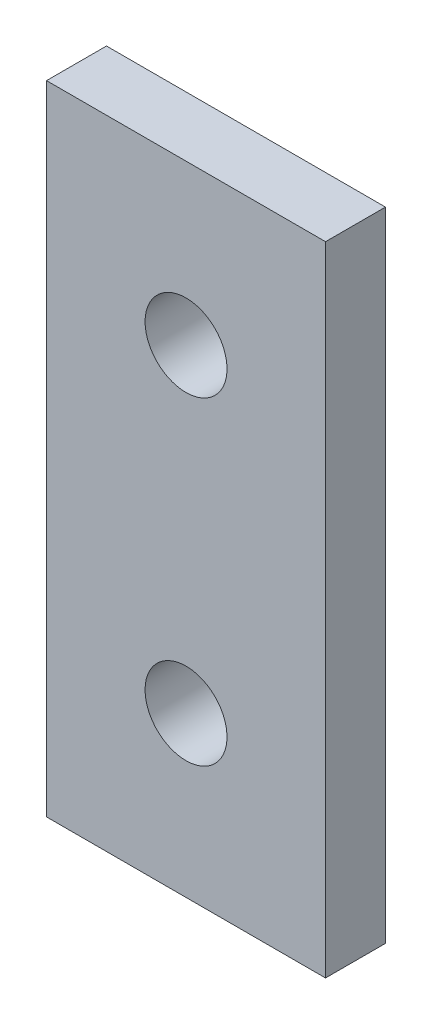
ISO-10303-21;
HEADER;
FILE_DESCRIPTION(('STEP AP214'),'2;1');
FILE_NAME('part.step','',(''),(''),'','','');
FILE_SCHEMA(('AUTOMOTIVE_DESIGN { 1 0 10303 214 1 1 1 1 }'));
ENDSEC;
DATA;
#1=APPLICATION_CONTEXT('core data for automotive mechanical design processes');
#2=APPLICATION_PROTOCOL_DEFINITION('international standard','automotive_design',2000,#1);
#3=PRODUCT_CONTEXT('',#1,'mechanical');
#4=PRODUCT('Part','Part','',(#3));
#5=PRODUCT_RELATED_PRODUCT_CATEGORY('part','',(#4));
#6=PRODUCT_DEFINITION_FORMATION('','',#4);
#7=PRODUCT_DEFINITION_CONTEXT('part definition',#1,'design');
#8=PRODUCT_DEFINITION('design','',#6,#7);
#9=PRODUCT_DEFINITION_SHAPE('','',#8);
#10=(LENGTH_UNIT() NAMED_UNIT(*) SI_UNIT(.MILLI.,.METRE.));
#11=(NAMED_UNIT(*) PLANE_ANGLE_UNIT() SI_UNIT($,.RADIAN.));
#12=(NAMED_UNIT(*) SI_UNIT($,.STERADIAN.) SOLID_ANGLE_UNIT());
#13=UNCERTAINTY_MEASURE_WITH_UNIT(LENGTH_MEASURE(1.E-05),#10,'distance_accuracy_value','');
#14=(GEOMETRIC_REPRESENTATION_CONTEXT(3) GLOBAL_UNCERTAINTY_ASSIGNED_CONTEXT((#13)) GLOBAL_UNIT_ASSIGNED_CONTEXT((#10,
#11,#12)) REPRESENTATION_CONTEXT('',''));
#15=CARTESIAN_POINT('',(0.,0.,0.));
#16=DIRECTION('',(0.,0.,1.));
#17=DIRECTION('',(1.,0.,0.));
#18=AXIS2_PLACEMENT_3D('',#15,#16,#17);
#19=CARTESIAN_POINT('',(11.1125,0.,0.));
#20=DIRECTION('',(1.,0.,0.));
#21=DIRECTION('',(0.,0.,-1.));
#22=AXIS2_PLACEMENT_3D('',#19,#20,#21);
#23=PLANE('',#22);
#24=DIRECTION('',(0.,1.,0.));
#25=VECTOR('',#24,1.);
#26=CARTESIAN_POINT('',(11.1125,0.,4.7752));
#27=LINE('',#26,#25);
#28=CARTESIAN_POINT('',(11.1125,0.,4.7752));
#29=VERTEX_POINT('',#28);
#30=CARTESIAN_POINT('',(11.1125,50.8,4.7752));
#31=VERTEX_POINT('',#30);
#32=EDGE_CURVE('E116',#29,#31,#27,.T.);
#33=ORIENTED_EDGE('',*,*,#32,.F.);
#34=DIRECTION('',(0.,0.,1.));
#35=VECTOR('',#34,1.);
#36=CARTESIAN_POINT('',(11.1125,0.,0.));
#37=LINE('',#36,#35);
#38=CARTESIAN_POINT('',(11.1125,0.,0.));
#39=VERTEX_POINT('',#38);
#40=EDGE_CURVE('E11',#39,#29,#37,.T.);
#41=ORIENTED_EDGE('',*,*,#40,.F.);
#42=DIRECTION('',(0.,1.,0.));
#43=VECTOR('',#42,1.);
#44=CARTESIAN_POINT('',(11.1125,0.,0.));
#45=LINE('',#44,#43);
#46=CARTESIAN_POINT('',(11.1125,50.8,0.));
#47=VERTEX_POINT('',#46);
#48=EDGE_CURVE('E107',#39,#47,#45,.T.);
#49=ORIENTED_EDGE('',*,*,#48,.T.);
#50=DIRECTION('',(0.,0.,1.));
#51=VECTOR('',#50,1.);
#52=CARTESIAN_POINT('',(11.1125,50.8,0.));
#53=LINE('',#52,#51);
#54=EDGE_CURVE('E48',#47,#31,#53,.T.);
#55=ORIENTED_EDGE('',*,*,#54,.T.);
#56=EDGE_LOOP('',(#33,#41,#49,#55));
#57=FACE_BOUND('',#56,.T.);
#58=ADVANCED_FACE('F45',(#57),#23,.T.);
#59=CARTESIAN_POINT('',(-11.1125,0.,0.));
#60=DIRECTION('',(0.,-1.,0.));
#61=DIRECTION('',(0.,0.,-1.));
#62=AXIS2_PLACEMENT_3D('',#59,#60,#61);
#63=PLANE('',#62);
#64=DIRECTION('',(1.,0.,0.));
#65=VECTOR('',#64,1.);
#66=CARTESIAN_POINT('',(-11.1125,0.,4.7752));
#67=LINE('',#66,#65);
#68=CARTESIAN_POINT('',(-11.1125,0.,4.7752));
#69=VERTEX_POINT('',#68);
#70=EDGE_CURVE('E110',#69,#29,#67,.T.);
#71=ORIENTED_EDGE('',*,*,#70,.F.);
#72=DIRECTION('',(0.,0.,1.));
#73=VECTOR('',#72,1.);
#74=CARTESIAN_POINT('',(-11.1125,0.,0.));
#75=LINE('',#74,#73);
#76=CARTESIAN_POINT('',(-11.1125,0.,0.));
#77=VERTEX_POINT('',#76);
#78=EDGE_CURVE('E55',#77,#69,#75,.T.);
#79=ORIENTED_EDGE('',*,*,#78,.F.);
#80=DIRECTION('',(1.,0.,0.));
#81=VECTOR('',#80,1.);
#82=CARTESIAN_POINT('',(-11.1125,0.,0.));
#83=LINE('',#82,#81);
#84=EDGE_CURVE('E102',#77,#39,#83,.T.);
#85=ORIENTED_EDGE('',*,*,#84,.T.);
#86=ORIENTED_EDGE('',*,*,#40,.T.);
#87=EDGE_LOOP('',(#71,#79,#85,#86));
#88=FACE_BOUND('',#87,.T.);
#89=ADVANCED_FACE('F133',(#88),#63,.T.);
#90=CARTESIAN_POINT('',(-11.1125,50.8,0.));
#91=DIRECTION('',(-1.,0.,0.));
#92=DIRECTION('',(0.,0.,1.));
#93=AXIS2_PLACEMENT_3D('',#90,#91,#92);
#94=PLANE('',#93);
#95=DIRECTION('',(0.,-1.,0.));
#96=VECTOR('',#95,1.);
#97=CARTESIAN_POINT('',(-11.1125,50.8,4.7752));
#98=LINE('',#97,#96);
#99=CARTESIAN_POINT('',(-11.1125,50.8,4.7752));
#100=VERTEX_POINT('',#99);
#101=EDGE_CURVE('E96',#100,#69,#98,.T.);
#102=ORIENTED_EDGE('',*,*,#101,.F.);
#103=DIRECTION('',(0.,0.,1.));
#104=VECTOR('',#103,1.);
#105=CARTESIAN_POINT('',(-11.1125,50.8,0.));
#106=LINE('',#105,#104);
#107=CARTESIAN_POINT('',(-11.1125,50.8,0.));
#108=VERTEX_POINT('',#107);
#109=EDGE_CURVE('E91',#108,#100,#106,.T.);
#110=ORIENTED_EDGE('',*,*,#109,.F.);
#111=DIRECTION('',(0.,-1.,0.));
#112=VECTOR('',#111,1.);
#113=CARTESIAN_POINT('',(-11.1125,50.8,0.));
#114=LINE('',#113,#112);
#115=EDGE_CURVE('E94',#108,#77,#114,.T.);
#116=ORIENTED_EDGE('',*,*,#115,.T.);
#117=ORIENTED_EDGE('',*,*,#78,.T.);
#118=EDGE_LOOP('',(#102,#110,#116,#117));
#119=FACE_BOUND('',#118,.T.);
#120=ADVANCED_FACE('F93',(#119),#94,.T.);
#121=CARTESIAN_POINT('',(11.1125,50.8,0.));
#122=DIRECTION('',(0.,1.,0.));
#123=DIRECTION('',(0.,0.,1.));
#124=AXIS2_PLACEMENT_3D('',#121,#122,#123);
#125=PLANE('',#124);
#126=DIRECTION('',(-1.,0.,0.));
#127=VECTOR('',#126,1.);
#128=CARTESIAN_POINT('',(11.1125,50.8,4.7752));
#129=LINE('',#128,#127);
#130=EDGE_CURVE('E120',#31,#100,#129,.T.);
#131=ORIENTED_EDGE('',*,*,#130,.F.);
#132=ORIENTED_EDGE('',*,*,#54,.F.);
#133=DIRECTION('',(-1.,0.,0.));
#134=VECTOR('',#133,1.);
#135=CARTESIAN_POINT('',(11.1125,50.8,0.));
#136=LINE('',#135,#134);
#137=EDGE_CURVE('E101',#47,#108,#136,.T.);
#138=ORIENTED_EDGE('',*,*,#137,.T.);
#139=ORIENTED_EDGE('',*,*,#109,.T.);
#140=EDGE_LOOP('',(#131,#132,#138,#139));
#141=FACE_BOUND('',#140,.T.);
#142=ADVANCED_FACE('F105',(#141),#125,.T.);
#143=CARTESIAN_POINT('',(0.,0.,0.));
#144=DIRECTION('',(0.,0.,1.));
#145=DIRECTION('',(1.,0.,0.));
#146=AXIS2_PLACEMENT_3D('',#143,#144,#145);
#147=PLANE('',#146);
#148=CARTESIAN_POINT('',(0.,12.7,0.));
#149=DIRECTION('',(0.,0.,1.));
#150=DIRECTION('',(-1.,0.,0.));
#151=AXIS2_PLACEMENT_3D('',#148,#149,#150);
#152=CIRCLE('',#151,3.2639);
#153=CARTESIAN_POINT('',(-3.2639,12.7,0.));
#154=VERTEX_POINT('',#153);
#155=EDGE_CURVE('E166',#154,#154,#152,.T.);
#156=ORIENTED_EDGE('',*,*,#155,.T.);
#157=EDGE_LOOP('',(#156));
#158=FACE_BOUND('',#157,.T.);
#159=CARTESIAN_POINT('',(0.,38.1,0.));
#160=DIRECTION('',(0.,0.,1.));
#161=DIRECTION('',(-1.,0.,0.));
#162=AXIS2_PLACEMENT_3D('',#159,#160,#161);
#163=CIRCLE('',#162,3.2639);
#164=CARTESIAN_POINT('',(-3.2639,38.1,0.));
#165=VERTEX_POINT('',#164);
#166=EDGE_CURVE('E121',#165,#165,#163,.T.);
#167=ORIENTED_EDGE('',*,*,#166,.T.);
#168=EDGE_LOOP('',(#167));
#169=FACE_BOUND('',#168,.T.);
#170=ORIENTED_EDGE('',*,*,#48,.F.);
#171=ORIENTED_EDGE('',*,*,#84,.F.);
#172=ORIENTED_EDGE('',*,*,#115,.F.);
#173=ORIENTED_EDGE('',*,*,#137,.F.);
#174=EDGE_LOOP('',(#170,#171,#172,#173));
#175=FACE_BOUND('',#174,.T.);
#176=ADVANCED_FACE('F100',(#158,#169,#175),#147,.F.);
#177=CARTESIAN_POINT('',(0.,0.,4.7752));
#178=DIRECTION('',(0.,0.,1.));
#179=DIRECTION('',(1.,0.,0.));
#180=AXIS2_PLACEMENT_3D('',#177,#178,#179);
#181=PLANE('',#180);
#182=CARTESIAN_POINT('',(0.,12.7,4.7752));
#183=DIRECTION('',(0.,0.,1.));
#184=DIRECTION('',(-1.,0.,0.));
#185=AXIS2_PLACEMENT_3D('',#182,#183,#184);
#186=CIRCLE('',#185,3.2639);
#187=CARTESIAN_POINT('',(-3.2639,12.7,4.7752));
#188=VERTEX_POINT('',#187);
#189=EDGE_CURVE('E169',#188,#188,#186,.T.);
#190=ORIENTED_EDGE('',*,*,#189,.F.);
#191=EDGE_LOOP('',(#190));
#192=FACE_BOUND('',#191,.T.);
#193=CARTESIAN_POINT('',(0.,38.1,4.7752));
#194=DIRECTION('',(0.,0.,1.));
#195=DIRECTION('',(-1.,0.,0.));
#196=AXIS2_PLACEMENT_3D('',#193,#194,#195);
#197=CIRCLE('',#196,3.2639);
#198=CARTESIAN_POINT('',(-3.2639,38.1,4.7752));
#199=VERTEX_POINT('',#198);
#200=EDGE_CURVE('E173',#199,#199,#197,.T.);
#201=ORIENTED_EDGE('',*,*,#200,.F.);
#202=EDGE_LOOP('',(#201));
#203=FACE_BOUND('',#202,.T.);
#204=ORIENTED_EDGE('',*,*,#32,.T.);
#205=ORIENTED_EDGE('',*,*,#130,.T.);
#206=ORIENTED_EDGE('',*,*,#101,.T.);
#207=ORIENTED_EDGE('',*,*,#70,.T.);
#208=EDGE_LOOP('',(#204,#205,#206,#207));
#209=FACE_BOUND('',#208,.T.);
#210=ADVANCED_FACE('F132',(#192,#203,#209),#181,.T.);
#211=CARTESIAN_POINT('',(0.,38.1,0.));
#212=DIRECTION('',(0.,0.,1.));
#213=DIRECTION('',(1.,0.,0.));
#214=AXIS2_PLACEMENT_3D('',#211,#212,#213);
#215=CYLINDRICAL_SURFACE('',#214,3.2639);
#216=ORIENTED_EDGE('',*,*,#166,.F.);
#217=EDGE_LOOP('',(#216));
#218=FACE_BOUND('',#217,.T.);
#219=ORIENTED_EDGE('',*,*,#200,.T.);
#220=EDGE_LOOP('',(#219));
#221=FACE_BOUND('',#220,.T.);
#222=ADVANCED_FACE('F151',(#218,#221),#215,.F.);
#223=CARTESIAN_POINT('',(0.,12.7,0.));
#224=DIRECTION('',(0.,0.,1.));
#225=DIRECTION('',(1.,0.,0.));
#226=AXIS2_PLACEMENT_3D('',#223,#224,#225);
#227=CYLINDRICAL_SURFACE('',#226,3.2639);
#228=ORIENTED_EDGE('',*,*,#155,.F.);
#229=EDGE_LOOP('',(#228));
#230=FACE_BOUND('',#229,.T.);
#231=ORIENTED_EDGE('',*,*,#189,.T.);
#232=EDGE_LOOP('',(#231));
#233=FACE_BOUND('',#232,.T.);
#234=ADVANCED_FACE('F158',(#230,#233),#227,.F.);
#235=CLOSED_SHELL('',(#58,#89,#120,#142,#176,#210,#222,#234));
#236=MANIFOLD_SOLID_BREP('B2',#235);
#237=ADVANCED_BREP_SHAPE_REPRESENTATION('',(#18,#236),#14);
#238=SHAPE_DEFINITION_REPRESENTATION(#9,#237);
ENDSEC;
END-ISO-10303-21;
